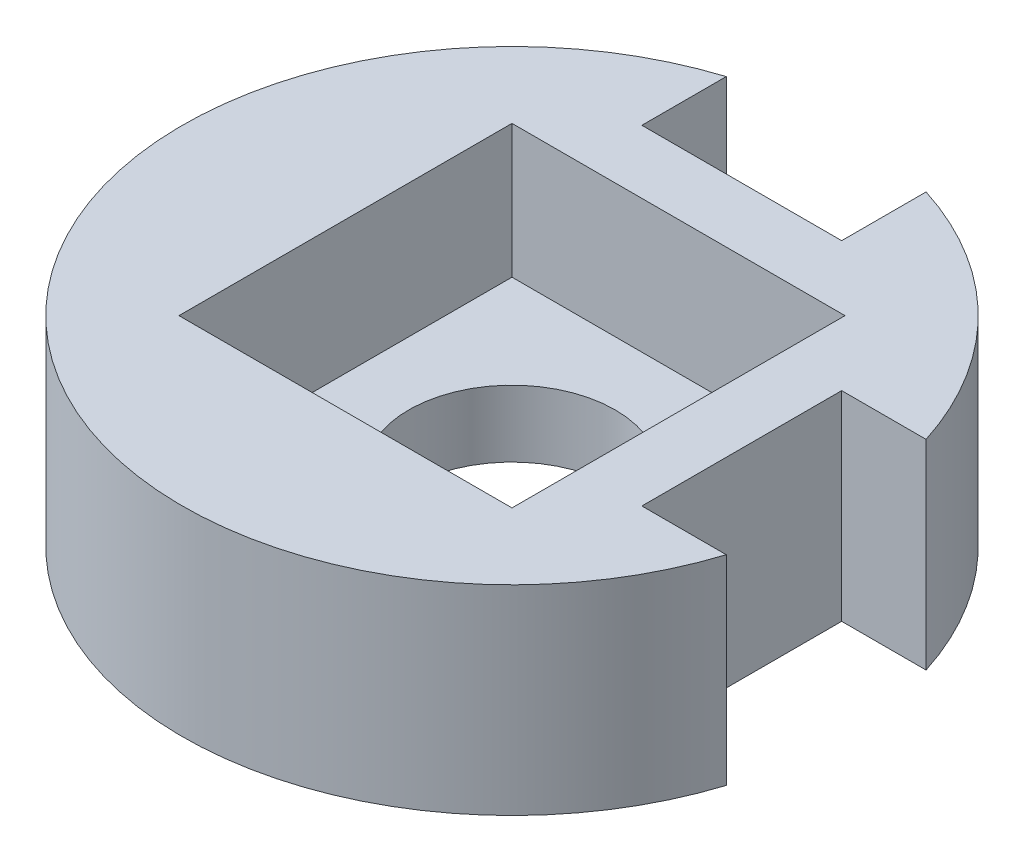
ISO-10303-21;
HEADER;
FILE_DESCRIPTION(('STEP AP214'),'2;1');
FILE_NAME('part.step','',(''),(''),'','','');
FILE_SCHEMA(('AUTOMOTIVE_DESIGN { 1 0 10303 214 1 1 1 1 }'));
ENDSEC;
DATA;
#1=APPLICATION_CONTEXT('core data for automotive mechanical design processes');
#2=APPLICATION_PROTOCOL_DEFINITION('international standard','automotive_design',2000,#1);
#3=PRODUCT_CONTEXT('',#1,'mechanical');
#4=PRODUCT('Part','Part','',(#3));
#5=PRODUCT_RELATED_PRODUCT_CATEGORY('part','',(#4));
#6=PRODUCT_DEFINITION_FORMATION('','',#4);
#7=PRODUCT_DEFINITION_CONTEXT('part definition',#1,'design');
#8=PRODUCT_DEFINITION('design','',#6,#7);
#9=PRODUCT_DEFINITION_SHAPE('','',#8);
#10=(LENGTH_UNIT() NAMED_UNIT(*) SI_UNIT(.MILLI.,.METRE.));
#11=(NAMED_UNIT(*) PLANE_ANGLE_UNIT() SI_UNIT($,.RADIAN.));
#12=(NAMED_UNIT(*) SI_UNIT($,.STERADIAN.) SOLID_ANGLE_UNIT());
#13=UNCERTAINTY_MEASURE_WITH_UNIT(LENGTH_MEASURE(1.E-05),#10,'distance_accuracy_value','');
#14=(GEOMETRIC_REPRESENTATION_CONTEXT(3) GLOBAL_UNCERTAINTY_ASSIGNED_CONTEXT((#13)) GLOBAL_UNIT_ASSIGNED_CONTEXT((#10,
#11,#12)) REPRESENTATION_CONTEXT('',''));
#15=CARTESIAN_POINT('',(0.,0.,0.));
#16=DIRECTION('',(0.,0.,1.));
#17=DIRECTION('',(1.,0.,0.));
#18=AXIS2_PLACEMENT_3D('',#15,#16,#17);
#19=CARTESIAN_POINT('',(0.,6.,-5.));
#20=DIRECTION('',(0.,0.,-1.));
#21=DIRECTION('',(-1.,0.,0.));
#22=AXIS2_PLACEMENT_3D('',#19,#20,#21);
#23=PLANE('',#22);
#24=DIRECTION('',(1.,0.,0.));
#25=VECTOR('',#24,1.);
#26=CARTESIAN_POINT('',(-5.,2.,-5.));
#27=LINE('',#26,#25);
#28=CARTESIAN_POINT('',(-5.,2.,-5.));
#29=VERTEX_POINT('',#28);
#30=CARTESIAN_POINT('',(5.,2.,-5.));
#31=VERTEX_POINT('',#30);
#32=EDGE_CURVE('E55',#29,#31,#27,.T.);
#33=ORIENTED_EDGE('',*,*,#32,.T.);
#34=DIRECTION('',(0.,-1.,0.));
#35=VECTOR('',#34,1.);
#36=CARTESIAN_POINT('',(5.,6.,-5.));
#37=LINE('',#36,#35);
#38=CARTESIAN_POINT('',(5.,6.,-5.));
#39=VERTEX_POINT('',#38);
#40=EDGE_CURVE('E42',#39,#31,#37,.T.);
#41=ORIENTED_EDGE('',*,*,#40,.F.);
#42=DIRECTION('',(1.,0.,0.));
#43=VECTOR('',#42,1.);
#44=CARTESIAN_POINT('',(0.,6.,-5.));
#45=LINE('',#44,#43);
#46=CARTESIAN_POINT('',(-5.,6.,-5.));
#47=VERTEX_POINT('',#46);
#48=EDGE_CURVE('E186',#47,#39,#45,.T.);
#49=ORIENTED_EDGE('',*,*,#48,.F.);
#50=DIRECTION('',(0.,-1.,0.));
#51=VECTOR('',#50,1.);
#52=CARTESIAN_POINT('',(-5.,6.,-5.));
#53=LINE('',#52,#51);
#54=EDGE_CURVE('E162',#47,#29,#53,.T.);
#55=ORIENTED_EDGE('',*,*,#54,.T.);
#56=EDGE_LOOP('',(#33,#41,#49,#55));
#57=FACE_BOUND('',#56,.T.);
#58=ADVANCED_FACE('F39',(#57),#23,.F.);
#59=CARTESIAN_POINT('',(5.,6.,0.));
#60=DIRECTION('',(1.,0.,0.));
#61=DIRECTION('',(0.,0.,-1.));
#62=AXIS2_PLACEMENT_3D('',#59,#60,#61);
#63=PLANE('',#62);
#64=DIRECTION('',(0.,0.,1.));
#65=VECTOR('',#64,1.);
#66=CARTESIAN_POINT('',(5.,2.,5.));
#67=LINE('',#66,#65);
#68=CARTESIAN_POINT('',(5.,2.,5.));
#69=VERTEX_POINT('',#68);
#70=EDGE_CURVE('E210',#31,#69,#67,.T.);
#71=ORIENTED_EDGE('',*,*,#70,.T.);
#72=DIRECTION('',(0.,-1.,0.));
#73=VECTOR('',#72,1.);
#74=CARTESIAN_POINT('',(5.,6.,5.));
#75=LINE('',#74,#73);
#76=CARTESIAN_POINT('',(5.,6.,5.));
#77=VERTEX_POINT('',#76);
#78=EDGE_CURVE('E200',#77,#69,#75,.T.);
#79=ORIENTED_EDGE('',*,*,#78,.F.);
#80=DIRECTION('',(0.,0.,1.));
#81=VECTOR('',#80,1.);
#82=CARTESIAN_POINT('',(5.,6.,0.));
#83=LINE('',#82,#81);
#84=EDGE_CURVE('E104',#39,#77,#83,.T.);
#85=ORIENTED_EDGE('',*,*,#84,.F.);
#86=ORIENTED_EDGE('',*,*,#40,.T.);
#87=EDGE_LOOP('',(#71,#79,#85,#86));
#88=FACE_BOUND('',#87,.T.);
#89=ADVANCED_FACE('F209',(#88),#63,.F.);
#90=CARTESIAN_POINT('',(0.,6.,5.));
#91=DIRECTION('',(0.,0.,-1.));
#92=DIRECTION('',(-1.,0.,0.));
#93=AXIS2_PLACEMENT_3D('',#90,#91,#92);
#94=PLANE('',#93);
#95=ORIENTED_EDGE('',*,*,#78,.T.);
#96=DIRECTION('',(-1.,0.,0.));
#97=VECTOR('',#96,1.);
#98=CARTESIAN_POINT('',(-5.,2.,5.));
#99=LINE('',#98,#97);
#100=CARTESIAN_POINT('',(-5.,2.,5.));
#101=VERTEX_POINT('',#100);
#102=EDGE_CURVE('E170',#69,#101,#99,.T.);
#103=ORIENTED_EDGE('',*,*,#102,.T.);
#104=DIRECTION('',(0.,-1.,0.));
#105=VECTOR('',#104,1.);
#106=CARTESIAN_POINT('',(-5.,6.,5.));
#107=LINE('',#106,#105);
#108=CARTESIAN_POINT('',(-5.,6.,5.));
#109=VERTEX_POINT('',#108);
#110=EDGE_CURVE('E198',#109,#101,#107,.T.);
#111=ORIENTED_EDGE('',*,*,#110,.F.);
#112=DIRECTION('',(1.,0.,0.));
#113=VECTOR('',#112,1.);
#114=CARTESIAN_POINT('',(0.,6.,5.));
#115=LINE('',#114,#113);
#116=EDGE_CURVE('E225',#109,#77,#115,.T.);
#117=ORIENTED_EDGE('',*,*,#116,.T.);
#118=EDGE_LOOP('',(#95,#103,#111,#117));
#119=FACE_BOUND('',#118,.T.);
#120=ADVANCED_FACE('F267',(#119),#94,.T.);
#121=CARTESIAN_POINT('',(-5.,6.,0.));
#122=DIRECTION('',(1.,0.,0.));
#123=DIRECTION('',(0.,0.,-1.));
#124=AXIS2_PLACEMENT_3D('',#121,#122,#123);
#125=PLANE('',#124);
#126=ORIENTED_EDGE('',*,*,#110,.T.);
#127=DIRECTION('',(0.,0.,-1.));
#128=VECTOR('',#127,1.);
#129=CARTESIAN_POINT('',(-5.,2.,5.));
#130=LINE('',#129,#128);
#131=EDGE_CURVE('E215',#101,#29,#130,.T.);
#132=ORIENTED_EDGE('',*,*,#131,.T.);
#133=ORIENTED_EDGE('',*,*,#54,.F.);
#134=DIRECTION('',(0.,0.,1.));
#135=VECTOR('',#134,1.);
#136=CARTESIAN_POINT('',(-5.,6.,0.));
#137=LINE('',#136,#135);
#138=EDGE_CURVE('E227',#47,#109,#137,.T.);
#139=ORIENTED_EDGE('',*,*,#138,.T.);
#140=EDGE_LOOP('',(#126,#132,#133,#139));
#141=FACE_BOUND('',#140,.T.);
#142=ADVANCED_FACE('F271',(#141),#125,.T.);
#143=CARTESIAN_POINT('',(0.,6.,-3.));
#144=DIRECTION('',(0.,0.,-1.));
#145=DIRECTION('',(-1.,0.,0.));
#146=AXIS2_PLACEMENT_3D('',#143,#144,#145);
#147=PLANE('',#146);
#148=DIRECTION('',(1.,0.,0.));
#149=VECTOR('',#148,1.);
#150=CARTESIAN_POINT('',(0.,0.,-3.));
#151=LINE('',#150,#149);
#152=CARTESIAN_POINT('',(6.9,0.,-3.));
#153=VERTEX_POINT('',#152);
#154=CARTESIAN_POINT('',(9.43451111610983,0.,-3.));
#155=VERTEX_POINT('',#154);
#156=EDGE_CURVE('E167',#153,#155,#151,.T.);
#157=ORIENTED_EDGE('',*,*,#156,.T.);
#158=DIRECTION('',(0.,-1.,0.));
#159=VECTOR('',#158,1.);
#160=CARTESIAN_POINT('',(9.43451111610983,6.,-3.));
#161=LINE('',#160,#159);
#162=CARTESIAN_POINT('',(9.43451111610983,6.,-3.));
#163=VERTEX_POINT('',#162);
#164=EDGE_CURVE('E11',#163,#155,#161,.T.);
#165=ORIENTED_EDGE('',*,*,#164,.F.);
#166=DIRECTION('',(1.,0.,0.));
#167=VECTOR('',#166,1.);
#168=CARTESIAN_POINT('',(0.,6.,-3.));
#169=LINE('',#168,#167);
#170=CARTESIAN_POINT('',(6.9,6.,-3.));
#171=VERTEX_POINT('',#170);
#172=EDGE_CURVE('E230',#171,#163,#169,.T.);
#173=ORIENTED_EDGE('',*,*,#172,.F.);
#174=DIRECTION('',(0.,-1.,0.));
#175=VECTOR('',#174,1.);
#176=CARTESIAN_POINT('',(6.9,6.,-3.));
#177=LINE('',#176,#175);
#178=EDGE_CURVE('E64',#171,#153,#177,.T.);
#179=ORIENTED_EDGE('',*,*,#178,.T.);
#180=EDGE_LOOP('',(#157,#165,#173,#179));
#181=FACE_BOUND('',#180,.T.);
#182=ADVANCED_FACE('F246',(#181),#147,.F.);
#183=CARTESIAN_POINT('',(0.,6.,0.));
#184=DIRECTION('',(0.,-1.,0.));
#185=DIRECTION('',(0.,0.,-1.));
#186=AXIS2_PLACEMENT_3D('',#183,#184,#185);
#187=CYLINDRICAL_SURFACE('',#186,9.9);
#188=CARTESIAN_POINT('',(0.,0.,0.));
#189=DIRECTION('',(0.,1.,0.));
#190=DIRECTION('',(0.,0.,1.));
#191=AXIS2_PLACEMENT_3D('',#188,#189,#190);
#192=CIRCLE('',#191,9.9);
#193=CARTESIAN_POINT('',(3.,0.,-9.43451111610983));
#194=VERTEX_POINT('',#193);
#195=EDGE_CURVE('E169',#155,#194,#192,.T.);
#196=ORIENTED_EDGE('',*,*,#195,.T.);
#197=DIRECTION('',(0.,-1.,0.));
#198=VECTOR('',#197,1.);
#199=CARTESIAN_POINT('',(3.,6.,-9.43451111610983));
#200=LINE('',#199,#198);
#201=CARTESIAN_POINT('',(3.,6.,-9.43451111610983));
#202=VERTEX_POINT('',#201);
#203=EDGE_CURVE('E47',#202,#194,#200,.T.);
#204=ORIENTED_EDGE('',*,*,#203,.F.);
#205=CARTESIAN_POINT('',(0.,6.,0.));
#206=DIRECTION('',(0.,1.,0.));
#207=DIRECTION('',(0.,0.,1.));
#208=AXIS2_PLACEMENT_3D('',#205,#206,#207);
#209=CIRCLE('',#208,9.9);
#210=EDGE_CURVE('E147',#163,#202,#209,.T.);
#211=ORIENTED_EDGE('',*,*,#210,.F.);
#212=ORIENTED_EDGE('',*,*,#164,.T.);
#213=EDGE_LOOP('',(#196,#204,#211,#212));
#214=FACE_BOUND('',#213,.T.);
#215=ADVANCED_FACE('F248',(#214),#187,.T.);
#216=CARTESIAN_POINT('',(3.,6.,0.));
#217=DIRECTION('',(1.,0.,0.));
#218=DIRECTION('',(0.,0.,-1.));
#219=AXIS2_PLACEMENT_3D('',#216,#217,#218);
#220=PLANE('',#219);
#221=DIRECTION('',(0.,0.,1.));
#222=VECTOR('',#221,1.);
#223=CARTESIAN_POINT('',(3.,0.,0.));
#224=LINE('',#223,#222);
#225=CARTESIAN_POINT('',(3.,0.,-6.9));
#226=VERTEX_POINT('',#225);
#227=EDGE_CURVE('E172',#194,#226,#224,.T.);
#228=ORIENTED_EDGE('',*,*,#227,.T.);
#229=DIRECTION('',(0.,-1.,0.));
#230=VECTOR('',#229,1.);
#231=CARTESIAN_POINT('',(3.,6.,-6.9));
#232=LINE('',#231,#230);
#233=CARTESIAN_POINT('',(3.,6.,-6.9));
#234=VERTEX_POINT('',#233);
#235=EDGE_CURVE('E192',#234,#226,#232,.T.);
#236=ORIENTED_EDGE('',*,*,#235,.F.);
#237=DIRECTION('',(0.,0.,1.));
#238=VECTOR('',#237,1.);
#239=CARTESIAN_POINT('',(3.,6.,0.));
#240=LINE('',#239,#238);
#241=EDGE_CURVE('E232',#202,#234,#240,.T.);
#242=ORIENTED_EDGE('',*,*,#241,.F.);
#243=ORIENTED_EDGE('',*,*,#203,.T.);
#244=EDGE_LOOP('',(#228,#236,#242,#243));
#245=FACE_BOUND('',#244,.T.);
#246=ADVANCED_FACE('F253',(#245),#220,.F.);
#247=CARTESIAN_POINT('',(0.,6.,-6.9));
#248=DIRECTION('',(0.,0.,-1.));
#249=DIRECTION('',(-1.,0.,0.));
#250=AXIS2_PLACEMENT_3D('',#247,#248,#249);
#251=PLANE('',#250);
#252=DIRECTION('',(1.,0.,0.));
#253=VECTOR('',#252,1.);
#254=CARTESIAN_POINT('',(0.,0.,-6.9));
#255=LINE('',#254,#253);
#256=CARTESIAN_POINT('',(-3.,0.,-6.9));
#257=VERTEX_POINT('',#256);
#258=EDGE_CURVE('E175',#257,#226,#255,.T.);
#259=ORIENTED_EDGE('',*,*,#258,.F.);
#260=DIRECTION('',(0.,-1.,0.));
#261=VECTOR('',#260,1.);
#262=CARTESIAN_POINT('',(-3.,6.,-6.9));
#263=LINE('',#262,#261);
#264=CARTESIAN_POINT('',(-3.,6.,-6.9));
#265=VERTEX_POINT('',#264);
#266=EDGE_CURVE('E190',#265,#257,#263,.T.);
#267=ORIENTED_EDGE('',*,*,#266,.F.);
#268=DIRECTION('',(1.,0.,0.));
#269=VECTOR('',#268,1.);
#270=CARTESIAN_POINT('',(0.,6.,-6.9));
#271=LINE('',#270,#269);
#272=EDGE_CURVE('E233',#265,#234,#271,.T.);
#273=ORIENTED_EDGE('',*,*,#272,.T.);
#274=ORIENTED_EDGE('',*,*,#235,.T.);
#275=EDGE_LOOP('',(#259,#267,#273,#274));
#276=FACE_BOUND('',#275,.T.);
#277=ADVANCED_FACE('F254',(#276),#251,.T.);
#278=CARTESIAN_POINT('',(-3.,6.,0.));
#279=DIRECTION('',(1.,0.,0.));
#280=DIRECTION('',(0.,0.,-1.));
#281=AXIS2_PLACEMENT_3D('',#278,#279,#280);
#282=PLANE('',#281);
#283=DIRECTION('',(0.,0.,1.));
#284=VECTOR('',#283,1.);
#285=CARTESIAN_POINT('',(-3.,0.,0.));
#286=LINE('',#285,#284);
#287=CARTESIAN_POINT('',(-3.,0.,-9.43451111610983));
#288=VERTEX_POINT('',#287);
#289=EDGE_CURVE('E178',#288,#257,#286,.T.);
#290=ORIENTED_EDGE('',*,*,#289,.F.);
#291=DIRECTION('',(0.,-1.,0.));
#292=VECTOR('',#291,1.);
#293=CARTESIAN_POINT('',(-3.,6.,-9.43451111610983));
#294=LINE('',#293,#292);
#295=CARTESIAN_POINT('',(-3.,6.,-9.43451111610983));
#296=VERTEX_POINT('',#295);
#297=EDGE_CURVE('E156',#296,#288,#294,.T.);
#298=ORIENTED_EDGE('',*,*,#297,.F.);
#299=DIRECTION('',(0.,0.,1.));
#300=VECTOR('',#299,1.);
#301=CARTESIAN_POINT('',(-3.,6.,0.));
#302=LINE('',#301,#300);
#303=EDGE_CURVE('E144',#296,#265,#302,.T.);
#304=ORIENTED_EDGE('',*,*,#303,.T.);
#305=ORIENTED_EDGE('',*,*,#266,.T.);
#306=EDGE_LOOP('',(#290,#298,#304,#305));
#307=FACE_BOUND('',#306,.T.);
#308=ADVANCED_FACE('F238',(#307),#282,.T.);
#309=CARTESIAN_POINT('',(9.43451111610983,0.,3.));
#310=VERTEX_POINT('',#309);
#311=EDGE_CURVE('E152',#288,#310,#192,.T.);
#312=ORIENTED_EDGE('',*,*,#311,.T.);
#313=DIRECTION('',(0.,-1.,0.));
#314=VECTOR('',#313,1.);
#315=CARTESIAN_POINT('',(9.43451111610983,6.,3.));
#316=LINE('',#315,#314);
#317=CARTESIAN_POINT('',(9.43451111610983,6.,3.));
#318=VERTEX_POINT('',#317);
#319=EDGE_CURVE('E149',#318,#310,#316,.T.);
#320=ORIENTED_EDGE('',*,*,#319,.F.);
#321=EDGE_CURVE('E135',#296,#318,#209,.T.);
#322=ORIENTED_EDGE('',*,*,#321,.F.);
#323=ORIENTED_EDGE('',*,*,#297,.T.);
#324=EDGE_LOOP('',(#312,#320,#322,#323));
#325=FACE_BOUND('',#324,.T.);
#326=ADVANCED_FACE('F150',(#325),#187,.T.);
#327=CARTESIAN_POINT('',(0.,6.,3.));
#328=DIRECTION('',(0.,0.,-1.));
#329=DIRECTION('',(-1.,0.,0.));
#330=AXIS2_PLACEMENT_3D('',#327,#328,#329);
#331=PLANE('',#330);
#332=DIRECTION('',(1.,0.,0.));
#333=VECTOR('',#332,1.);
#334=CARTESIAN_POINT('',(0.,0.,3.));
#335=LINE('',#334,#333);
#336=CARTESIAN_POINT('',(6.9,0.,3.));
#337=VERTEX_POINT('',#336);
#338=EDGE_CURVE('E181',#337,#310,#335,.T.);
#339=ORIENTED_EDGE('',*,*,#338,.F.);
#340=DIRECTION('',(0.,-1.,0.));
#341=VECTOR('',#340,1.);
#342=CARTESIAN_POINT('',(6.9,6.,3.));
#343=LINE('',#342,#341);
#344=CARTESIAN_POINT('',(6.9,6.,3.));
#345=VERTEX_POINT('',#344);
#346=EDGE_CURVE('E157',#345,#337,#343,.T.);
#347=ORIENTED_EDGE('',*,*,#346,.F.);
#348=DIRECTION('',(1.,0.,0.));
#349=VECTOR('',#348,1.);
#350=CARTESIAN_POINT('',(0.,6.,3.));
#351=LINE('',#350,#349);
#352=EDGE_CURVE('E141',#345,#318,#351,.T.);
#353=ORIENTED_EDGE('',*,*,#352,.T.);
#354=ORIENTED_EDGE('',*,*,#319,.T.);
#355=EDGE_LOOP('',(#339,#347,#353,#354));
#356=FACE_BOUND('',#355,.T.);
#357=ADVANCED_FACE('F159',(#356),#331,.T.);
#358=CARTESIAN_POINT('',(6.9,6.,0.));
#359=DIRECTION('',(1.,0.,0.));
#360=DIRECTION('',(0.,0.,-1.));
#361=AXIS2_PLACEMENT_3D('',#358,#359,#360);
#362=PLANE('',#361);
#363=DIRECTION('',(0.,0.,1.));
#364=VECTOR('',#363,1.);
#365=CARTESIAN_POINT('',(6.9,0.,0.));
#366=LINE('',#365,#364);
#367=EDGE_CURVE('E183',#153,#337,#366,.T.);
#368=ORIENTED_EDGE('',*,*,#367,.F.);
#369=ORIENTED_EDGE('',*,*,#178,.F.);
#370=DIRECTION('',(0.,0.,1.));
#371=VECTOR('',#370,1.);
#372=CARTESIAN_POINT('',(6.9,6.,0.));
#373=LINE('',#372,#371);
#374=EDGE_CURVE('E160',#171,#345,#373,.T.);
#375=ORIENTED_EDGE('',*,*,#374,.T.);
#376=ORIENTED_EDGE('',*,*,#346,.T.);
#377=EDGE_LOOP('',(#368,#369,#375,#376));
#378=FACE_BOUND('',#377,.T.);
#379=ADVANCED_FACE('F243',(#378),#362,.T.);
#380=CARTESIAN_POINT('',(0.,6.,0.));
#381=DIRECTION('',(0.,1.,0.));
#382=DIRECTION('',(0.,0.,1.));
#383=AXIS2_PLACEMENT_3D('',#380,#381,#382);
#384=PLANE('',#383);
#385=ORIENTED_EDGE('',*,*,#48,.T.);
#386=ORIENTED_EDGE('',*,*,#84,.T.);
#387=ORIENTED_EDGE('',*,*,#116,.F.);
#388=ORIENTED_EDGE('',*,*,#138,.F.);
#389=EDGE_LOOP('',(#385,#386,#387,#388));
#390=FACE_BOUND('',#389,.T.);
#391=ORIENTED_EDGE('',*,*,#172,.T.);
#392=ORIENTED_EDGE('',*,*,#210,.T.);
#393=ORIENTED_EDGE('',*,*,#241,.T.);
#394=ORIENTED_EDGE('',*,*,#272,.F.);
#395=ORIENTED_EDGE('',*,*,#303,.F.);
#396=ORIENTED_EDGE('',*,*,#321,.T.);
#397=ORIENTED_EDGE('',*,*,#352,.F.);
#398=ORIENTED_EDGE('',*,*,#374,.F.);
#399=EDGE_LOOP('',(#391,#392,#393,#394,#395,#396,#397,#398));
#400=FACE_BOUND('',#399,.T.);
#401=ADVANCED_FACE('F138',(#390,#400),#384,.T.);
#402=CARTESIAN_POINT('',(0.,0.,0.));
#403=DIRECTION('',(0.,1.,0.));
#404=DIRECTION('',(0.,0.,1.));
#405=AXIS2_PLACEMENT_3D('',#402,#403,#404);
#406=PLANE('',#405);
#407=ORIENTED_EDGE('',*,*,#156,.F.);
#408=ORIENTED_EDGE('',*,*,#367,.T.);
#409=ORIENTED_EDGE('',*,*,#338,.T.);
#410=ORIENTED_EDGE('',*,*,#311,.F.);
#411=ORIENTED_EDGE('',*,*,#289,.T.);
#412=ORIENTED_EDGE('',*,*,#258,.T.);
#413=ORIENTED_EDGE('',*,*,#227,.F.);
#414=ORIENTED_EDGE('',*,*,#195,.F.);
#415=EDGE_LOOP('',(#407,#408,#409,#410,#411,#412,#413,#414));
#416=FACE_BOUND('',#415,.T.);
#417=CARTESIAN_POINT('',(0.,0.,0.));
#418=DIRECTION('',(0.,-1.,0.));
#419=DIRECTION('',(0.,0.,-1.));
#420=AXIS2_PLACEMENT_3D('',#417,#418,#419);
#421=CIRCLE('',#420,3.1);
#422=CARTESIAN_POINT('',(0.,0.,-3.1));
#423=VERTEX_POINT('',#422);
#424=EDGE_CURVE('E313',#423,#423,#421,.T.);
#425=ORIENTED_EDGE('',*,*,#424,.F.);
#426=EDGE_LOOP('',(#425));
#427=FACE_BOUND('',#426,.T.);
#428=ADVANCED_FACE('F241',(#416,#427),#406,.F.);
#429=CARTESIAN_POINT('',(0.,2.,0.));
#430=DIRECTION('',(0.,-1.,0.));
#431=DIRECTION('',(0.,0.,-1.));
#432=AXIS2_PLACEMENT_3D('',#429,#430,#431);
#433=PLANE('',#432);
#434=CARTESIAN_POINT('',(0.,2.,0.));
#435=DIRECTION('',(0.,-1.,0.));
#436=DIRECTION('',(0.,0.,-1.));
#437=AXIS2_PLACEMENT_3D('',#434,#435,#436);
#438=CIRCLE('',#437,3.1);
#439=CARTESIAN_POINT('',(0.,2.,-3.1));
#440=VERTEX_POINT('',#439);
#441=EDGE_CURVE('E218',#440,#440,#438,.T.);
#442=ORIENTED_EDGE('',*,*,#441,.T.);
#443=EDGE_LOOP('',(#442));
#444=FACE_BOUND('',#443,.T.);
#445=ORIENTED_EDGE('',*,*,#131,.F.);
#446=ORIENTED_EDGE('',*,*,#102,.F.);
#447=ORIENTED_EDGE('',*,*,#70,.F.);
#448=ORIENTED_EDGE('',*,*,#32,.F.);
#449=EDGE_LOOP('',(#445,#446,#447,#448));
#450=FACE_BOUND('',#449,.T.);
#451=ADVANCED_FACE('F296',(#444,#450),#433,.F.);
#452=CARTESIAN_POINT('',(0.,2.,0.));
#453=DIRECTION('',(0.,-1.,0.));
#454=DIRECTION('',(0.,0.,-1.));
#455=AXIS2_PLACEMENT_3D('',#452,#453,#454);
#456=CYLINDRICAL_SURFACE('',#455,3.1);
#457=ORIENTED_EDGE('',*,*,#441,.F.);
#458=EDGE_LOOP('',(#457));
#459=FACE_BOUND('',#458,.T.);
#460=ORIENTED_EDGE('',*,*,#424,.T.);
#461=EDGE_LOOP('',(#460));
#462=FACE_BOUND('',#461,.T.);
#463=ADVANCED_FACE('F302',(#459,#462),#456,.F.);
#464=CLOSED_SHELL('',(#58,#89,#120,#142,#182,#215,#246,#277,#308,#326,#357,#379,#401,#428,#451,#463));
#465=MANIFOLD_SOLID_BREP('B2',#464);
#466=ADVANCED_BREP_SHAPE_REPRESENTATION('',(#18,#465),#14);
#467=SHAPE_DEFINITION_REPRESENTATION(#9,#466);
ENDSEC;
END-ISO-10303-21;
